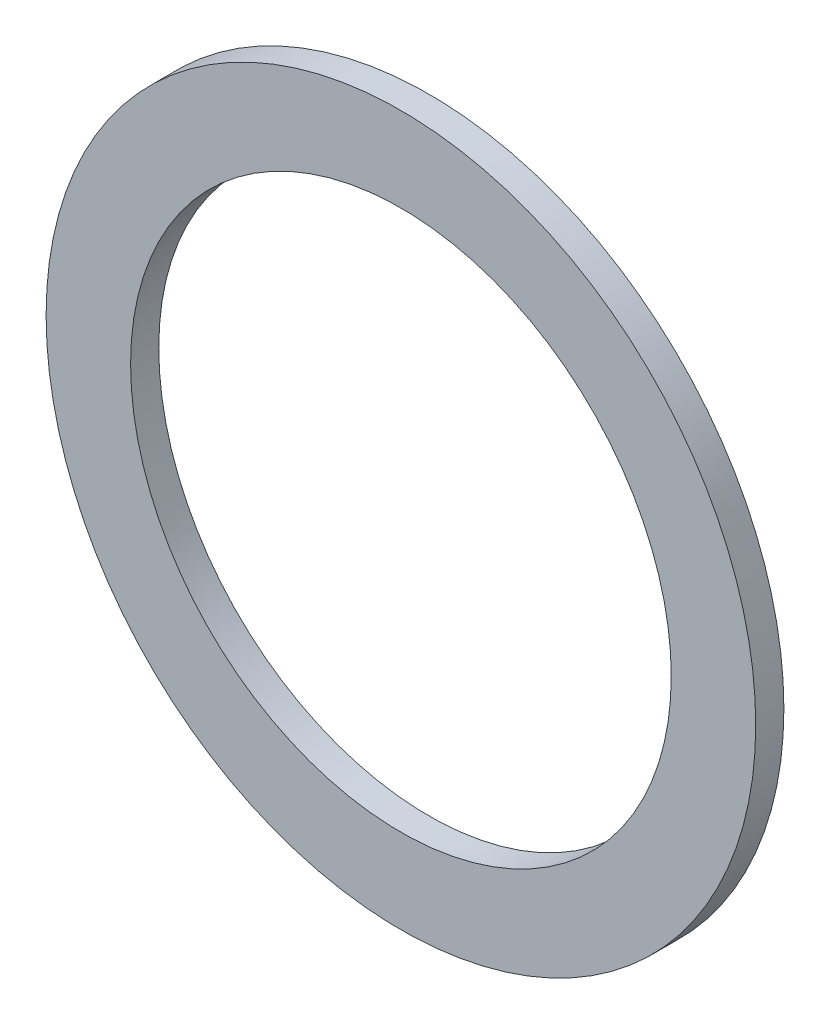
ISO-10303-21;
HEADER;
FILE_DESCRIPTION(('STEP AP214'),'2;1');
FILE_NAME('part.step','',(''),(''),'','','');
FILE_SCHEMA(('AUTOMOTIVE_DESIGN { 1 0 10303 214 1 1 1 1 }'));
ENDSEC;
DATA;
#1=APPLICATION_CONTEXT('core data for automotive mechanical design processes');
#2=APPLICATION_PROTOCOL_DEFINITION('international standard','automotive_design',2000,#1);
#3=PRODUCT_CONTEXT('',#1,'mechanical');
#4=PRODUCT('Part','Part','',(#3));
#5=PRODUCT_RELATED_PRODUCT_CATEGORY('part','',(#4));
#6=PRODUCT_DEFINITION_FORMATION('','',#4);
#7=PRODUCT_DEFINITION_CONTEXT('part definition',#1,'design');
#8=PRODUCT_DEFINITION('design','',#6,#7);
#9=PRODUCT_DEFINITION_SHAPE('','',#8);
#10=(LENGTH_UNIT() NAMED_UNIT(*) SI_UNIT(.MILLI.,.METRE.));
#11=(NAMED_UNIT(*) PLANE_ANGLE_UNIT() SI_UNIT($,.RADIAN.));
#12=(NAMED_UNIT(*) SI_UNIT($,.STERADIAN.) SOLID_ANGLE_UNIT());
#13=UNCERTAINTY_MEASURE_WITH_UNIT(LENGTH_MEASURE(1.E-05),#10,'distance_accuracy_value','');
#14=(GEOMETRIC_REPRESENTATION_CONTEXT(3) GLOBAL_UNCERTAINTY_ASSIGNED_CONTEXT((#13)) GLOBAL_UNIT_ASSIGNED_CONTEXT((#10,
#11,#12)) REPRESENTATION_CONTEXT('',''));
#15=CARTESIAN_POINT('',(0.,0.,0.));
#16=DIRECTION('',(0.,0.,1.));
#17=DIRECTION('',(1.,0.,0.));
#18=AXIS2_PLACEMENT_3D('',#15,#16,#17);
#19=CARTESIAN_POINT('',(0.,0.,0.5));
#20=DIRECTION('',(0.,0.,1.));
#21=DIRECTION('',(1.,0.,0.));
#22=AXIS2_PLACEMENT_3D('',#19,#20,#21);
#23=PLANE('',#22);
#24=CARTESIAN_POINT('',(0.,0.,0.5));
#25=DIRECTION('',(0.,0.,1.));
#26=DIRECTION('',(1.,0.,0.));
#27=AXIS2_PLACEMENT_3D('',#24,#25,#26);
#28=CIRCLE('',#27,6.3);
#29=CARTESIAN_POINT('',(6.3,0.,0.5));
#30=VERTEX_POINT('',#29);
#31=EDGE_CURVE('E10',#30,#30,#28,.T.);
#32=ORIENTED_EDGE('',*,*,#31,.T.);
#33=EDGE_LOOP('',(#32));
#34=FACE_BOUND('',#33,.T.);
#35=CARTESIAN_POINT('',(0.,0.,0.5));
#36=DIRECTION('',(0.,0.,1.));
#37=DIRECTION('',(1.,0.,0.));
#38=AXIS2_PLACEMENT_3D('',#35,#36,#37);
#39=CIRCLE('',#38,4.8);
#40=CARTESIAN_POINT('',(4.8,0.,0.5));
#41=VERTEX_POINT('',#40);
#42=EDGE_CURVE('E41',#41,#41,#39,.T.);
#43=ORIENTED_EDGE('',*,*,#42,.F.);
#44=EDGE_LOOP('',(#43));
#45=FACE_BOUND('',#44,.T.);
#46=ADVANCED_FACE('F30',(#34,#45),#23,.T.);
#47=CARTESIAN_POINT('',(0.,0.,0.));
#48=DIRECTION('',(0.,0.,1.));
#49=DIRECTION('',(1.,0.,0.));
#50=AXIS2_PLACEMENT_3D('',#47,#48,#49);
#51=PLANE('',#50);
#52=CARTESIAN_POINT('',(0.,0.,0.));
#53=DIRECTION('',(0.,0.,1.));
#54=DIRECTION('',(1.,0.,0.));
#55=AXIS2_PLACEMENT_3D('',#52,#53,#54);
#56=CIRCLE('',#55,6.3);
#57=CARTESIAN_POINT('',(6.3,0.,0.));
#58=VERTEX_POINT('',#57);
#59=EDGE_CURVE('E34',#58,#58,#56,.T.);
#60=ORIENTED_EDGE('',*,*,#59,.F.);
#61=EDGE_LOOP('',(#60));
#62=FACE_BOUND('',#61,.T.);
#63=CARTESIAN_POINT('',(0.,0.,0.));
#64=DIRECTION('',(0.,0.,1.));
#65=DIRECTION('',(1.,0.,0.));
#66=AXIS2_PLACEMENT_3D('',#63,#64,#65);
#67=CIRCLE('',#66,4.8);
#68=CARTESIAN_POINT('',(4.8,0.,0.));
#69=VERTEX_POINT('',#68);
#70=EDGE_CURVE('E43',#69,#69,#67,.T.);
#71=ORIENTED_EDGE('',*,*,#70,.T.);
#72=EDGE_LOOP('',(#71));
#73=FACE_BOUND('',#72,.T.);
#74=ADVANCED_FACE('F53',(#62,#73),#51,.F.);
#75=CARTESIAN_POINT('',(0.,0.,0.5));
#76=DIRECTION('',(0.,0.,-1.));
#77=DIRECTION('',(-1.,0.,0.));
#78=AXIS2_PLACEMENT_3D('',#75,#76,#77);
#79=CYLINDRICAL_SURFACE('',#78,6.3);
#80=ORIENTED_EDGE('',*,*,#31,.F.);
#81=EDGE_LOOP('',(#80));
#82=FACE_BOUND('',#81,.T.);
#83=ORIENTED_EDGE('',*,*,#59,.T.);
#84=EDGE_LOOP('',(#83));
#85=FACE_BOUND('',#84,.T.);
#86=ADVANCED_FACE('F32',(#82,#85),#79,.T.);
#87=CARTESIAN_POINT('',(0.,0.,0.5));
#88=DIRECTION('',(0.,0.,-1.));
#89=DIRECTION('',(-1.,0.,0.));
#90=AXIS2_PLACEMENT_3D('',#87,#88,#89);
#91=CYLINDRICAL_SURFACE('',#90,4.8);
#92=ORIENTED_EDGE('',*,*,#42,.T.);
#93=EDGE_LOOP('',(#92));
#94=FACE_BOUND('',#93,.T.);
#95=ORIENTED_EDGE('',*,*,#70,.F.);
#96=EDGE_LOOP('',(#95));
#97=FACE_BOUND('',#96,.T.);
#98=ADVANCED_FACE('F49',(#94,#97),#91,.F.);
#99=CLOSED_SHELL('',(#46,#74,#86,#98));
#100=MANIFOLD_SOLID_BREP('B2',#99);
#101=ADVANCED_BREP_SHAPE_REPRESENTATION('',(#18,#100),#14);
#102=SHAPE_DEFINITION_REPRESENTATION(#9,#101);
ENDSEC;
END-ISO-10303-21;
